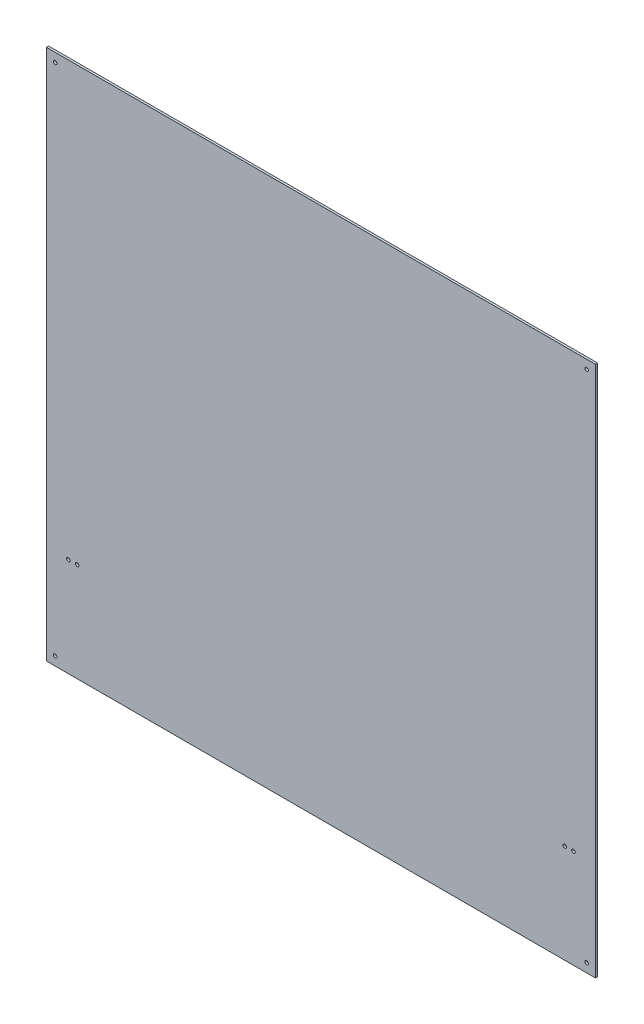
ISO-10303-21;
HEADER;
FILE_DESCRIPTION(('STEP AP214'),'2;1');
FILE_NAME('part.step','',(''),(''),'','','');
FILE_SCHEMA(('AUTOMOTIVE_DESIGN { 1 0 10303 214 1 1 1 1 }'));
ENDSEC;
DATA;
#1=APPLICATION_CONTEXT('core data for automotive mechanical design processes');
#2=APPLICATION_PROTOCOL_DEFINITION('international standard','automotive_design',2000,#1);
#3=PRODUCT_CONTEXT('',#1,'mechanical');
#4=PRODUCT('Part','Part','',(#3));
#5=PRODUCT_RELATED_PRODUCT_CATEGORY('part','',(#4));
#6=PRODUCT_DEFINITION_FORMATION('','',#4);
#7=PRODUCT_DEFINITION_CONTEXT('part definition',#1,'design');
#8=PRODUCT_DEFINITION('design','',#6,#7);
#9=PRODUCT_DEFINITION_SHAPE('','',#8);
#10=(LENGTH_UNIT() NAMED_UNIT(*) SI_UNIT(.MILLI.,.METRE.));
#11=(NAMED_UNIT(*) PLANE_ANGLE_UNIT() SI_UNIT($,.RADIAN.));
#12=(NAMED_UNIT(*) SI_UNIT($,.STERADIAN.) SOLID_ANGLE_UNIT());
#13=UNCERTAINTY_MEASURE_WITH_UNIT(LENGTH_MEASURE(1.E-05),#10,'distance_accuracy_value','');
#14=(GEOMETRIC_REPRESENTATION_CONTEXT(3) GLOBAL_UNCERTAINTY_ASSIGNED_CONTEXT((#13)) GLOBAL_UNIT_ASSIGNED_CONTEXT((#10,
#11,#12)) REPRESENTATION_CONTEXT('',''));
#15=CARTESIAN_POINT('',(0.,0.,0.));
#16=DIRECTION('',(0.,0.,1.));
#17=DIRECTION('',(1.,0.,0.));
#18=AXIS2_PLACEMENT_3D('',#15,#16,#17);
#19=CARTESIAN_POINT('',(-653.566371681416,554.672566371681,5.));
#20=DIRECTION('',(1.,0.,0.));
#21=DIRECTION('',(0.,1.,0.));
#22=AXIS2_PLACEMENT_3D('',#19,#20,#21);
#23=PLANE('',#22);
#24=DIRECTION('',(0.,-1.,0.));
#25=VECTOR('',#24,1.);
#26=CARTESIAN_POINT('',(-653.566371681416,554.672566371681,0.));
#27=LINE('',#26,#25);
#28=CARTESIAN_POINT('',(-653.566371681416,554.672566371681,0.));
#29=VERTEX_POINT('',#28);
#30=CARTESIAN_POINT('',(-653.566371681416,-655.327433628319,0.));
#31=VERTEX_POINT('',#30);
#32=EDGE_CURVE('E98',#29,#31,#27,.T.);
#33=ORIENTED_EDGE('',*,*,#32,.T.);
#34=DIRECTION('',(0.,0.,-1.));
#35=VECTOR('',#34,1.);
#36=CARTESIAN_POINT('',(-653.566371681416,-655.327433628319,5.));
#37=LINE('',#36,#35);
#38=CARTESIAN_POINT('',(-653.566371681416,-655.327433628319,5.));
#39=VERTEX_POINT('',#38);
#40=EDGE_CURVE('E11',#39,#31,#37,.T.);
#41=ORIENTED_EDGE('',*,*,#40,.F.);
#42=DIRECTION('',(0.,-1.,0.));
#43=VECTOR('',#42,1.);
#44=CARTESIAN_POINT('',(-653.566371681416,554.672566371681,5.));
#45=LINE('',#44,#43);
#46=CARTESIAN_POINT('',(-653.566371681416,554.672566371681,5.));
#47=VERTEX_POINT('',#46);
#48=EDGE_CURVE('E84',#47,#39,#45,.T.);
#49=ORIENTED_EDGE('',*,*,#48,.F.);
#50=DIRECTION('',(0.,0.,-1.));
#51=VECTOR('',#50,1.);
#52=CARTESIAN_POINT('',(-653.566371681416,554.672566371681,5.));
#53=LINE('',#52,#51);
#54=EDGE_CURVE('E51',#47,#29,#53,.T.);
#55=ORIENTED_EDGE('',*,*,#54,.T.);
#56=EDGE_LOOP('',(#33,#41,#49,#55));
#57=FACE_BOUND('',#56,.T.);
#58=ADVANCED_FACE('F35',(#57),#23,.F.);
#59=CARTESIAN_POINT('',(-653.566371681416,-655.327433628319,5.));
#60=DIRECTION('',(0.,1.,0.));
#61=DIRECTION('',(0.,0.,1.));
#62=AXIS2_PLACEMENT_3D('',#59,#60,#61);
#63=PLANE('',#62);
#64=DIRECTION('',(1.,0.,0.));
#65=VECTOR('',#64,1.);
#66=CARTESIAN_POINT('',(-653.566371681416,-655.327433628319,0.));
#67=LINE('',#66,#65);
#68=CARTESIAN_POINT('',(596.433628318584,-655.327433628319,0.));
#69=VERTEX_POINT('',#68);
#70=EDGE_CURVE('E89',#31,#69,#67,.T.);
#71=ORIENTED_EDGE('',*,*,#70,.T.);
#72=DIRECTION('',(0.,0.,-1.));
#73=VECTOR('',#72,1.);
#74=CARTESIAN_POINT('',(596.433628318584,-655.327433628319,5.));
#75=LINE('',#74,#73);
#76=CARTESIAN_POINT('',(596.433628318584,-655.327433628319,5.));
#77=VERTEX_POINT('',#76);
#78=EDGE_CURVE('E43',#77,#69,#75,.T.);
#79=ORIENTED_EDGE('',*,*,#78,.F.);
#80=DIRECTION('',(1.,0.,0.));
#81=VECTOR('',#80,1.);
#82=CARTESIAN_POINT('',(-653.566371681416,-655.327433628319,5.));
#83=LINE('',#82,#81);
#84=EDGE_CURVE('E76',#39,#77,#83,.T.);
#85=ORIENTED_EDGE('',*,*,#84,.F.);
#86=ORIENTED_EDGE('',*,*,#40,.T.);
#87=EDGE_LOOP('',(#71,#79,#85,#86));
#88=FACE_BOUND('',#87,.T.);
#89=ADVANCED_FACE('F88',(#88),#63,.F.);
#90=CARTESIAN_POINT('',(596.433628318584,554.672566371681,5.));
#91=DIRECTION('',(1.,0.,0.));
#92=DIRECTION('',(0.,1.,0.));
#93=AXIS2_PLACEMENT_3D('',#90,#91,#92);
#94=PLANE('',#93);
#95=DIRECTION('',(0.,-1.,0.));
#96=VECTOR('',#95,1.);
#97=CARTESIAN_POINT('',(596.433628318584,554.672566371681,0.));
#98=LINE('',#97,#96);
#99=CARTESIAN_POINT('',(596.433628318584,554.672566371681,0.));
#100=VERTEX_POINT('',#99);
#101=EDGE_CURVE('E102',#100,#69,#98,.T.);
#102=ORIENTED_EDGE('',*,*,#101,.F.);
#103=DIRECTION('',(0.,0.,-1.));
#104=VECTOR('',#103,1.);
#105=CARTESIAN_POINT('',(596.433628318584,554.672566371681,5.));
#106=LINE('',#105,#104);
#107=CARTESIAN_POINT('',(596.433628318584,554.672566371681,5.));
#108=VERTEX_POINT('',#107);
#109=EDGE_CURVE('E65',#108,#100,#106,.T.);
#110=ORIENTED_EDGE('',*,*,#109,.F.);
#111=DIRECTION('',(0.,-1.,0.));
#112=VECTOR('',#111,1.);
#113=CARTESIAN_POINT('',(596.433628318584,554.672566371681,5.));
#114=LINE('',#113,#112);
#115=EDGE_CURVE('E83',#108,#77,#114,.T.);
#116=ORIENTED_EDGE('',*,*,#115,.T.);
#117=ORIENTED_EDGE('',*,*,#78,.T.);
#118=EDGE_LOOP('',(#102,#110,#116,#117));
#119=FACE_BOUND('',#118,.T.);
#120=ADVANCED_FACE('F92',(#119),#94,.T.);
#121=CARTESIAN_POINT('',(-653.566371681416,554.672566371681,5.));
#122=DIRECTION('',(0.,1.,0.));
#123=DIRECTION('',(0.,0.,1.));
#124=AXIS2_PLACEMENT_3D('',#121,#122,#123);
#125=PLANE('',#124);
#126=DIRECTION('',(1.,0.,0.));
#127=VECTOR('',#126,1.);
#128=CARTESIAN_POINT('',(-653.566371681416,554.672566371681,0.));
#129=LINE('',#128,#127);
#130=EDGE_CURVE('E104',#29,#100,#129,.T.);
#131=ORIENTED_EDGE('',*,*,#130,.F.);
#132=ORIENTED_EDGE('',*,*,#54,.F.);
#133=DIRECTION('',(1.,0.,0.));
#134=VECTOR('',#133,1.);
#135=CARTESIAN_POINT('',(-653.566371681416,554.672566371681,5.));
#136=LINE('',#135,#134);
#137=EDGE_CURVE('E93',#47,#108,#136,.T.);
#138=ORIENTED_EDGE('',*,*,#137,.T.);
#139=ORIENTED_EDGE('',*,*,#109,.T.);
#140=EDGE_LOOP('',(#131,#132,#138,#139));
#141=FACE_BOUND('',#140,.T.);
#142=ADVANCED_FACE('F170',(#141),#125,.T.);
#143=CARTESIAN_POINT('',(0.,0.,5.));
#144=DIRECTION('',(0.,0.,1.));
#145=DIRECTION('',(1.,0.,0.));
#146=AXIS2_PLACEMENT_3D('',#143,#144,#145);
#147=PLANE('',#146);
#148=CARTESIAN_POINT('',(-603.566371681416,-430.327433628319,5.));
#149=DIRECTION('',(0.,0.,1.));
#150=DIRECTION('',(1.,0.,0.));
#151=AXIS2_PLACEMENT_3D('',#148,#149,#150);
#152=CIRCLE('',#151,4.05000000000002);
#153=CARTESIAN_POINT('',(-599.516371681416,-430.327433628319,5.));
#154=VERTEX_POINT('',#153);
#155=EDGE_CURVE('E152',#154,#154,#152,.T.);
#156=ORIENTED_EDGE('',*,*,#155,.F.);
#157=EDGE_LOOP('',(#156));
#158=FACE_BOUND('',#157,.T.);
#159=CARTESIAN_POINT('',(526.433628318584,-430.327433628319,5.));
#160=DIRECTION('',(0.,0.,1.));
#161=DIRECTION('',(1.,0.,0.));
#162=AXIS2_PLACEMENT_3D('',#159,#160,#161);
#163=CIRCLE('',#162,4.05000000000002);
#164=CARTESIAN_POINT('',(530.483628318584,-430.327433628319,5.));
#165=VERTEX_POINT('',#164);
#166=EDGE_CURVE('E146',#165,#165,#163,.T.);
#167=ORIENTED_EDGE('',*,*,#166,.F.);
#168=EDGE_LOOP('',(#167));
#169=FACE_BOUND('',#168,.T.);
#170=CARTESIAN_POINT('',(-583.566371681416,-430.327433628319,5.));
#171=DIRECTION('',(0.,0.,1.));
#172=DIRECTION('',(1.,0.,0.));
#173=AXIS2_PLACEMENT_3D('',#170,#171,#172);
#174=CIRCLE('',#173,4.05000000000002);
#175=CARTESIAN_POINT('',(-579.516371681416,-430.327433628319,5.));
#176=VERTEX_POINT('',#175);
#177=EDGE_CURVE('E140',#176,#176,#174,.T.);
#178=ORIENTED_EDGE('',*,*,#177,.F.);
#179=EDGE_LOOP('',(#178));
#180=FACE_BOUND('',#179,.T.);
#181=CARTESIAN_POINT('',(546.433628318584,-430.327433628319,5.));
#182=DIRECTION('',(0.,0.,1.));
#183=DIRECTION('',(1.,0.,0.));
#184=AXIS2_PLACEMENT_3D('',#181,#182,#183);
#185=CIRCLE('',#184,4.05000000000002);
#186=CARTESIAN_POINT('',(550.483628318584,-430.327433628319,5.));
#187=VERTEX_POINT('',#186);
#188=EDGE_CURVE('E134',#187,#187,#185,.T.);
#189=ORIENTED_EDGE('',*,*,#188,.F.);
#190=EDGE_LOOP('',(#189));
#191=FACE_BOUND('',#190,.T.);
#192=CARTESIAN_POINT('',(-633.566371681404,-635.327433628319,5.));
#193=DIRECTION('',(0.,0.,1.));
#194=DIRECTION('',(1.,0.,0.));
#195=AXIS2_PLACEMENT_3D('',#192,#193,#194);
#196=CIRCLE('',#195,4.05000000000001);
#197=CARTESIAN_POINT('',(-629.516371681404,-635.327433628319,5.));
#198=VERTEX_POINT('',#197);
#199=EDGE_CURVE('E116',#198,#198,#196,.T.);
#200=ORIENTED_EDGE('',*,*,#199,.F.);
#201=EDGE_LOOP('',(#200));
#202=FACE_BOUND('',#201,.T.);
#203=CARTESIAN_POINT('',(576.433628318596,-635.327433628319,5.));
#204=DIRECTION('',(0.,0.,1.));
#205=DIRECTION('',(1.,0.,0.));
#206=AXIS2_PLACEMENT_3D('',#203,#204,#205);
#207=CIRCLE('',#206,4.05000000000001);
#208=CARTESIAN_POINT('',(580.483628318596,-635.327433628319,5.));
#209=VERTEX_POINT('',#208);
#210=EDGE_CURVE('E123',#209,#209,#207,.T.);
#211=ORIENTED_EDGE('',*,*,#210,.F.);
#212=EDGE_LOOP('',(#211));
#213=FACE_BOUND('',#212,.T.);
#214=CARTESIAN_POINT('',(576.433628318584,534.672566371681,5.));
#215=DIRECTION('',(0.,0.,1.));
#216=DIRECTION('',(1.,0.,0.));
#217=AXIS2_PLACEMENT_3D('',#214,#215,#216);
#218=CIRCLE('',#217,4.05000000000001);
#219=CARTESIAN_POINT('',(580.483628318584,534.672566371681,5.));
#220=VERTEX_POINT('',#219);
#221=EDGE_CURVE('E129',#220,#220,#218,.T.);
#222=ORIENTED_EDGE('',*,*,#221,.F.);
#223=EDGE_LOOP('',(#222));
#224=FACE_BOUND('',#223,.T.);
#225=CARTESIAN_POINT('',(-633.566371681416,534.672566371681,5.));
#226=DIRECTION('',(0.,0.,1.));
#227=DIRECTION('',(1.,0.,0.));
#228=AXIS2_PLACEMENT_3D('',#225,#226,#227);
#229=CIRCLE('',#228,4.05000000000001);
#230=CARTESIAN_POINT('',(-629.516371681416,534.672566371681,5.));
#231=VERTEX_POINT('',#230);
#232=EDGE_CURVE('E110',#231,#231,#229,.T.);
#233=ORIENTED_EDGE('',*,*,#232,.F.);
#234=EDGE_LOOP('',(#233));
#235=FACE_BOUND('',#234,.T.);
#236=ORIENTED_EDGE('',*,*,#48,.T.);
#237=ORIENTED_EDGE('',*,*,#84,.T.);
#238=ORIENTED_EDGE('',*,*,#115,.F.);
#239=ORIENTED_EDGE('',*,*,#137,.F.);
#240=EDGE_LOOP('',(#236,#237,#238,#239));
#241=FACE_BOUND('',#240,.T.);
#242=ADVANCED_FACE('F80',(#158,#169,#180,#191,#202,#213,#224,#235,#241),#147,.T.);
#243=CARTESIAN_POINT('',(0.,0.,0.));
#244=DIRECTION('',(0.,0.,1.));
#245=DIRECTION('',(1.,0.,0.));
#246=AXIS2_PLACEMENT_3D('',#243,#244,#245);
#247=PLANE('',#246);
#248=CARTESIAN_POINT('',(-603.566371681416,-430.327433628319,0.));
#249=DIRECTION('',(0.,0.,1.));
#250=DIRECTION('',(1.,0.,0.));
#251=AXIS2_PLACEMENT_3D('',#248,#249,#250);
#252=CIRCLE('',#251,4.05000000000002);
#253=CARTESIAN_POINT('',(-599.516371681416,-430.327433628319,0.));
#254=VERTEX_POINT('',#253);
#255=EDGE_CURVE('E120',#254,#254,#252,.T.);
#256=ORIENTED_EDGE('',*,*,#255,.T.);
#257=EDGE_LOOP('',(#256));
#258=FACE_BOUND('',#257,.T.);
#259=CARTESIAN_POINT('',(526.433628318584,-430.327433628319,0.));
#260=DIRECTION('',(0.,0.,1.));
#261=DIRECTION('',(1.,0.,0.));
#262=AXIS2_PLACEMENT_3D('',#259,#260,#261);
#263=CIRCLE('',#262,4.05000000000002);
#264=CARTESIAN_POINT('',(530.483628318584,-430.327433628319,0.));
#265=VERTEX_POINT('',#264);
#266=EDGE_CURVE('E149',#265,#265,#263,.T.);
#267=ORIENTED_EDGE('',*,*,#266,.T.);
#268=EDGE_LOOP('',(#267));
#269=FACE_BOUND('',#268,.T.);
#270=CARTESIAN_POINT('',(-583.566371681416,-430.327433628319,0.));
#271=DIRECTION('',(0.,0.,1.));
#272=DIRECTION('',(1.,0.,0.));
#273=AXIS2_PLACEMENT_3D('',#270,#271,#272);
#274=CIRCLE('',#273,4.05000000000002);
#275=CARTESIAN_POINT('',(-579.516371681416,-430.327433628319,0.));
#276=VERTEX_POINT('',#275);
#277=EDGE_CURVE('E143',#276,#276,#274,.T.);
#278=ORIENTED_EDGE('',*,*,#277,.T.);
#279=EDGE_LOOP('',(#278));
#280=FACE_BOUND('',#279,.T.);
#281=CARTESIAN_POINT('',(546.433628318584,-430.327433628319,0.));
#282=DIRECTION('',(0.,0.,1.));
#283=DIRECTION('',(1.,0.,0.));
#284=AXIS2_PLACEMENT_3D('',#281,#282,#283);
#285=CIRCLE('',#284,4.05000000000002);
#286=CARTESIAN_POINT('',(550.483628318584,-430.327433628319,0.));
#287=VERTEX_POINT('',#286);
#288=EDGE_CURVE('E137',#287,#287,#285,.T.);
#289=ORIENTED_EDGE('',*,*,#288,.T.);
#290=EDGE_LOOP('',(#289));
#291=FACE_BOUND('',#290,.T.);
#292=CARTESIAN_POINT('',(-633.566371681404,-635.327433628319,0.));
#293=DIRECTION('',(0.,0.,1.));
#294=DIRECTION('',(1.,0.,0.));
#295=AXIS2_PLACEMENT_3D('',#292,#293,#294);
#296=CIRCLE('',#295,4.05000000000001);
#297=CARTESIAN_POINT('',(-629.516371681404,-635.327433628319,0.));
#298=VERTEX_POINT('',#297);
#299=EDGE_CURVE('E119',#298,#298,#296,.T.);
#300=ORIENTED_EDGE('',*,*,#299,.T.);
#301=EDGE_LOOP('',(#300));
#302=FACE_BOUND('',#301,.T.);
#303=CARTESIAN_POINT('',(576.433628318596,-635.327433628319,0.));
#304=DIRECTION('',(0.,0.,1.));
#305=DIRECTION('',(1.,0.,0.));
#306=AXIS2_PLACEMENT_3D('',#303,#304,#305);
#307=CIRCLE('',#306,4.05000000000001);
#308=CARTESIAN_POINT('',(580.483628318596,-635.327433628319,0.));
#309=VERTEX_POINT('',#308);
#310=EDGE_CURVE('E126',#309,#309,#307,.T.);
#311=ORIENTED_EDGE('',*,*,#310,.T.);
#312=EDGE_LOOP('',(#311));
#313=FACE_BOUND('',#312,.T.);
#314=CARTESIAN_POINT('',(576.433628318584,534.672566371681,0.));
#315=DIRECTION('',(0.,0.,1.));
#316=DIRECTION('',(1.,0.,0.));
#317=AXIS2_PLACEMENT_3D('',#314,#315,#316);
#318=CIRCLE('',#317,4.05000000000001);
#319=CARTESIAN_POINT('',(580.483628318584,534.672566371681,0.));
#320=VERTEX_POINT('',#319);
#321=EDGE_CURVE('E113',#320,#320,#318,.T.);
#322=ORIENTED_EDGE('',*,*,#321,.T.);
#323=EDGE_LOOP('',(#322));
#324=FACE_BOUND('',#323,.T.);
#325=CARTESIAN_POINT('',(-633.566371681416,534.672566371681,0.));
#326=DIRECTION('',(0.,0.,1.));
#327=DIRECTION('',(1.,0.,0.));
#328=AXIS2_PLACEMENT_3D('',#325,#326,#327);
#329=CIRCLE('',#328,4.05000000000001);
#330=CARTESIAN_POINT('',(-629.516371681416,534.672566371681,0.));
#331=VERTEX_POINT('',#330);
#332=EDGE_CURVE('E100',#331,#331,#329,.T.);
#333=ORIENTED_EDGE('',*,*,#332,.T.);
#334=EDGE_LOOP('',(#333));
#335=FACE_BOUND('',#334,.T.);
#336=ORIENTED_EDGE('',*,*,#32,.F.);
#337=ORIENTED_EDGE('',*,*,#130,.T.);
#338=ORIENTED_EDGE('',*,*,#101,.T.);
#339=ORIENTED_EDGE('',*,*,#70,.F.);
#340=EDGE_LOOP('',(#336,#337,#338,#339));
#341=FACE_BOUND('',#340,.T.);
#342=ADVANCED_FACE('F158',(#258,#269,#280,#291,#302,#313,#324,#335,#341),#247,.F.);
#343=CARTESIAN_POINT('',(-633.566371681416,534.672566371681,0.));
#344=DIRECTION('',(0.,0.,1.));
#345=DIRECTION('',(1.,0.,0.));
#346=AXIS2_PLACEMENT_3D('',#343,#344,#345);
#347=CYLINDRICAL_SURFACE('',#346,4.05000000000001);
#348=ORIENTED_EDGE('',*,*,#332,.F.);
#349=EDGE_LOOP('',(#348));
#350=FACE_BOUND('',#349,.T.);
#351=ORIENTED_EDGE('',*,*,#232,.T.);
#352=EDGE_LOOP('',(#351));
#353=FACE_BOUND('',#352,.T.);
#354=ADVANCED_FACE('F186',(#350,#353),#347,.F.);
#355=CARTESIAN_POINT('',(576.433628318584,534.672566371681,0.));
#356=DIRECTION('',(0.,0.,1.));
#357=DIRECTION('',(1.,0.,0.));
#358=AXIS2_PLACEMENT_3D('',#355,#356,#357);
#359=CYLINDRICAL_SURFACE('',#358,4.05000000000001);
#360=ORIENTED_EDGE('',*,*,#321,.F.);
#361=EDGE_LOOP('',(#360));
#362=FACE_BOUND('',#361,.T.);
#363=ORIENTED_EDGE('',*,*,#221,.T.);
#364=EDGE_LOOP('',(#363));
#365=FACE_BOUND('',#364,.T.);
#366=ADVANCED_FACE('F188',(#362,#365),#359,.F.);
#367=CARTESIAN_POINT('',(576.433628318596,-635.327433628319,0.));
#368=DIRECTION('',(0.,0.,1.));
#369=DIRECTION('',(1.,0.,0.));
#370=AXIS2_PLACEMENT_3D('',#367,#368,#369);
#371=CYLINDRICAL_SURFACE('',#370,4.05000000000001);
#372=ORIENTED_EDGE('',*,*,#310,.F.);
#373=EDGE_LOOP('',(#372));
#374=FACE_BOUND('',#373,.T.);
#375=ORIENTED_EDGE('',*,*,#210,.T.);
#376=EDGE_LOOP('',(#375));
#377=FACE_BOUND('',#376,.T.);
#378=ADVANCED_FACE('F195',(#374,#377),#371,.F.);
#379=CARTESIAN_POINT('',(-633.566371681404,-635.327433628319,0.));
#380=DIRECTION('',(0.,0.,1.));
#381=DIRECTION('',(1.,0.,0.));
#382=AXIS2_PLACEMENT_3D('',#379,#380,#381);
#383=CYLINDRICAL_SURFACE('',#382,4.05000000000001);
#384=ORIENTED_EDGE('',*,*,#299,.F.);
#385=EDGE_LOOP('',(#384));
#386=FACE_BOUND('',#385,.T.);
#387=ORIENTED_EDGE('',*,*,#199,.T.);
#388=EDGE_LOOP('',(#387));
#389=FACE_BOUND('',#388,.T.);
#390=ADVANCED_FACE('F258',(#386,#389),#383,.F.);
#391=CARTESIAN_POINT('',(546.433628318584,-430.327433628319,0.));
#392=DIRECTION('',(0.,0.,1.));
#393=DIRECTION('',(1.,0.,0.));
#394=AXIS2_PLACEMENT_3D('',#391,#392,#393);
#395=CYLINDRICAL_SURFACE('',#394,4.05000000000002);
#396=ORIENTED_EDGE('',*,*,#288,.F.);
#397=EDGE_LOOP('',(#396));
#398=FACE_BOUND('',#397,.T.);
#399=ORIENTED_EDGE('',*,*,#188,.T.);
#400=EDGE_LOOP('',(#399));
#401=FACE_BOUND('',#400,.T.);
#402=ADVANCED_FACE('F266',(#398,#401),#395,.F.);
#403=CARTESIAN_POINT('',(-583.566371681416,-430.327433628319,0.));
#404=DIRECTION('',(0.,0.,1.));
#405=DIRECTION('',(1.,0.,0.));
#406=AXIS2_PLACEMENT_3D('',#403,#404,#405);
#407=CYLINDRICAL_SURFACE('',#406,4.05000000000002);
#408=ORIENTED_EDGE('',*,*,#277,.F.);
#409=EDGE_LOOP('',(#408));
#410=FACE_BOUND('',#409,.T.);
#411=ORIENTED_EDGE('',*,*,#177,.T.);
#412=EDGE_LOOP('',(#411));
#413=FACE_BOUND('',#412,.T.);
#414=ADVANCED_FACE('F273',(#410,#413),#407,.F.);
#415=CARTESIAN_POINT('',(526.433628318584,-430.327433628319,0.));
#416=DIRECTION('',(0.,0.,1.));
#417=DIRECTION('',(1.,0.,0.));
#418=AXIS2_PLACEMENT_3D('',#415,#416,#417);
#419=CYLINDRICAL_SURFACE('',#418,4.05000000000002);
#420=ORIENTED_EDGE('',*,*,#266,.F.);
#421=EDGE_LOOP('',(#420));
#422=FACE_BOUND('',#421,.T.);
#423=ORIENTED_EDGE('',*,*,#166,.T.);
#424=EDGE_LOOP('',(#423));
#425=FACE_BOUND('',#424,.T.);
#426=ADVANCED_FACE('F164',(#422,#425),#419,.F.);
#427=CARTESIAN_POINT('',(-603.566371681416,-430.327433628319,0.));
#428=DIRECTION('',(0.,0.,1.));
#429=DIRECTION('',(1.,0.,0.));
#430=AXIS2_PLACEMENT_3D('',#427,#428,#429);
#431=CYLINDRICAL_SURFACE('',#430,4.05000000000002);
#432=ORIENTED_EDGE('',*,*,#255,.F.);
#433=EDGE_LOOP('',(#432));
#434=FACE_BOUND('',#433,.T.);
#435=ORIENTED_EDGE('',*,*,#155,.T.);
#436=EDGE_LOOP('',(#435));
#437=FACE_BOUND('',#436,.T.);
#438=ADVANCED_FACE('F161',(#434,#437),#431,.F.);
#439=CLOSED_SHELL('',(#58,#89,#120,#142,#242,#342,#354,#366,#378,#390,#402,#414,#426,#438));
#440=MANIFOLD_SOLID_BREP('B2',#439);
#441=ADVANCED_BREP_SHAPE_REPRESENTATION('',(#18,#440),#14);
#442=SHAPE_DEFINITION_REPRESENTATION(#9,#441);
ENDSEC;
END-ISO-10303-21;
